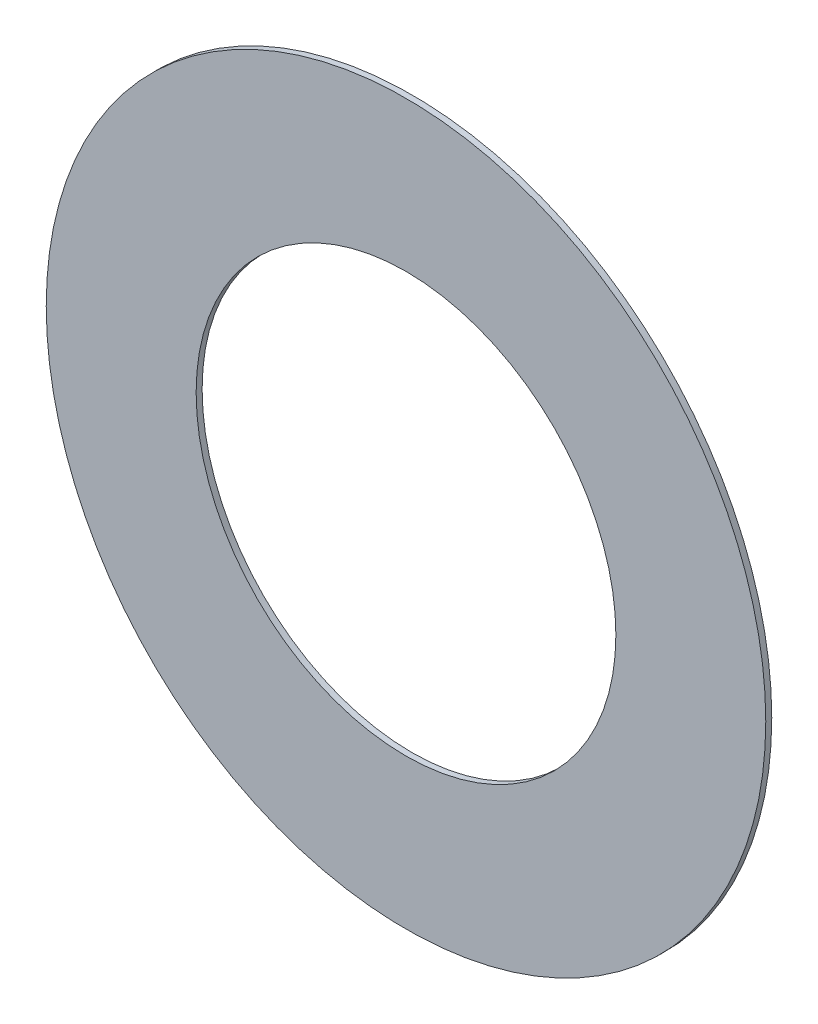
ISO-10303-21;
HEADER;
FILE_DESCRIPTION(('STEP AP214'),'2;1');
FILE_NAME('part.step','',(''),(''),'','','');
FILE_SCHEMA(('AUTOMOTIVE_DESIGN { 1 0 10303 214 1 1 1 1 }'));
ENDSEC;
DATA;
#1=APPLICATION_CONTEXT('core data for automotive mechanical design processes');
#2=APPLICATION_PROTOCOL_DEFINITION('international standard','automotive_design',2000,#1);
#3=PRODUCT_CONTEXT('',#1,'mechanical');
#4=PRODUCT('Part','Part','',(#3));
#5=PRODUCT_RELATED_PRODUCT_CATEGORY('part','',(#4));
#6=PRODUCT_DEFINITION_FORMATION('','',#4);
#7=PRODUCT_DEFINITION_CONTEXT('part definition',#1,'design');
#8=PRODUCT_DEFINITION('design','',#6,#7);
#9=PRODUCT_DEFINITION_SHAPE('','',#8);
#10=(LENGTH_UNIT() NAMED_UNIT(*) SI_UNIT(.MILLI.,.METRE.));
#11=(NAMED_UNIT(*) PLANE_ANGLE_UNIT() SI_UNIT($,.RADIAN.));
#12=(NAMED_UNIT(*) SI_UNIT($,.STERADIAN.) SOLID_ANGLE_UNIT());
#13=UNCERTAINTY_MEASURE_WITH_UNIT(LENGTH_MEASURE(1.E-05),#10,'distance_accuracy_value','');
#14=(GEOMETRIC_REPRESENTATION_CONTEXT(3) GLOBAL_UNCERTAINTY_ASSIGNED_CONTEXT((#13)) GLOBAL_UNIT_ASSIGNED_CONTEXT((#10,
#11,#12)) REPRESENTATION_CONTEXT('',''));
#15=CARTESIAN_POINT('',(0.,0.,0.));
#16=DIRECTION('',(0.,0.,1.));
#17=DIRECTION('',(1.,0.,0.));
#18=AXIS2_PLACEMENT_3D('',#15,#16,#17);
#19=CARTESIAN_POINT('',(0.,0.,0.01));
#20=DIRECTION('',(0.,0.,1.));
#21=DIRECTION('',(1.,0.,0.));
#22=AXIS2_PLACEMENT_3D('',#19,#20,#21);
#23=PLANE('',#22);
#24=CARTESIAN_POINT('',(-1.,5.43,0.01));
#25=DIRECTION('',(0.,0.,1.));
#26=DIRECTION('',(1.,0.,0.));
#27=AXIS2_PLACEMENT_3D('',#24,#25,#26);
#28=CIRCLE('',#27,0.35);
#29=CARTESIAN_POINT('',(-0.65,5.43,0.01));
#30=VERTEX_POINT('',#29);
#31=EDGE_CURVE('E27',#30,#30,#28,.F.);
#32=ORIENTED_EDGE('',*,*,#31,.T.);
#33=EDGE_LOOP('',(#32));
#34=FACE_BOUND('',#33,.T.);
#35=CARTESIAN_POINT('',(-1.,5.43,0.01));
#36=DIRECTION('',(0.,0.,1.));
#37=DIRECTION('',(1.,0.,0.));
#38=AXIS2_PLACEMENT_3D('',#35,#36,#37);
#39=CIRCLE('',#38,0.6);
#40=CARTESIAN_POINT('',(-0.4,5.43,0.01));
#41=VERTEX_POINT('',#40);
#42=EDGE_CURVE('E18',#41,#41,#39,.F.);
#43=ORIENTED_EDGE('',*,*,#42,.F.);
#44=EDGE_LOOP('',(#43));
#45=FACE_BOUND('',#44,.T.);
#46=ADVANCED_FACE('F15',(#34,#45),#23,.T.);
#47=CARTESIAN_POINT('',(-1.,5.43,0.));
#48=DIRECTION('',(0.,0.,1.));
#49=DIRECTION('',(1.,0.,0.));
#50=AXIS2_PLACEMENT_3D('',#47,#48,#49);
#51=CYLINDRICAL_SURFACE('',#50,0.6);
#52=ORIENTED_EDGE('',*,*,#42,.T.);
#53=EDGE_LOOP('',(#52));
#54=FACE_BOUND('',#53,.T.);
#55=CARTESIAN_POINT('',(-1.,5.43,0.));
#56=DIRECTION('',(0.,0.,1.));
#57=DIRECTION('',(1.,0.,0.));
#58=AXIS2_PLACEMENT_3D('',#55,#56,#57);
#59=CIRCLE('',#58,0.6);
#60=CARTESIAN_POINT('',(-0.4,5.43,0.));
#61=VERTEX_POINT('',#60);
#62=EDGE_CURVE('E22',#61,#61,#59,.T.);
#63=ORIENTED_EDGE('',*,*,#62,.T.);
#64=EDGE_LOOP('',(#63));
#65=FACE_BOUND('',#64,.T.);
#66=ADVANCED_FACE('F35',(#54,#65),#51,.T.);
#67=CARTESIAN_POINT('',(-1.,5.43,0.));
#68=DIRECTION('',(0.,0.,1.));
#69=DIRECTION('',(1.,0.,0.));
#70=AXIS2_PLACEMENT_3D('',#67,#68,#69);
#71=CYLINDRICAL_SURFACE('',#70,0.35);
#72=ORIENTED_EDGE('',*,*,#31,.F.);
#73=EDGE_LOOP('',(#72));
#74=FACE_BOUND('',#73,.T.);
#75=CARTESIAN_POINT('',(-1.,5.43,0.));
#76=DIRECTION('',(0.,0.,1.));
#77=DIRECTION('',(1.,0.,0.));
#78=AXIS2_PLACEMENT_3D('',#75,#76,#77);
#79=CIRCLE('',#78,0.35);
#80=CARTESIAN_POINT('',(-0.65,5.43,0.));
#81=VERTEX_POINT('',#80);
#82=EDGE_CURVE('E10',#81,#81,#79,.F.);
#83=ORIENTED_EDGE('',*,*,#82,.T.);
#84=EDGE_LOOP('',(#83));
#85=FACE_BOUND('',#84,.T.);
#86=ADVANCED_FACE('F43',(#74,#85),#71,.F.);
#87=CARTESIAN_POINT('',(0.,0.,0.));
#88=DIRECTION('',(0.,0.,1.));
#89=DIRECTION('',(1.,0.,0.));
#90=AXIS2_PLACEMENT_3D('',#87,#88,#89);
#91=PLANE('',#90);
#92=ORIENTED_EDGE('',*,*,#82,.F.);
#93=EDGE_LOOP('',(#92));
#94=FACE_BOUND('',#93,.T.);
#95=ORIENTED_EDGE('',*,*,#62,.F.);
#96=EDGE_LOOP('',(#95));
#97=FACE_BOUND('',#96,.T.);
#98=ADVANCED_FACE('F44',(#94,#97),#91,.F.);
#99=CLOSED_SHELL('',(#46,#66,#86,#98));
#100=MANIFOLD_SOLID_BREP('B1',#99);
#101=ADVANCED_BREP_SHAPE_REPRESENTATION('',(#18,#100),#14);
#102=SHAPE_DEFINITION_REPRESENTATION(#9,#101);
ENDSEC;
END-ISO-10303-21;
